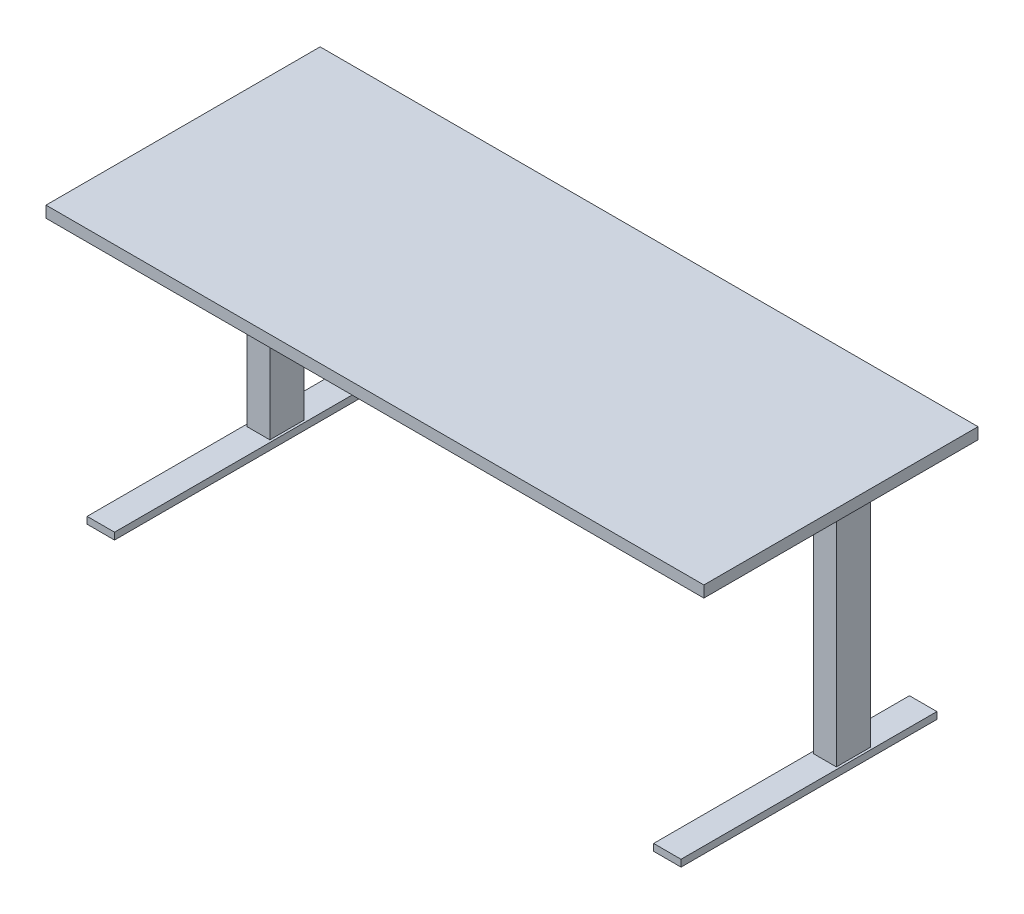
ISO-10303-21;
HEADER;
FILE_DESCRIPTION(('STEP AP214'),'2;1');
FILE_NAME('part.step','',(''),(''),'','','');
FILE_SCHEMA(('AUTOMOTIVE_DESIGN { 1 0 10303 214 1 1 1 1 }'));
ENDSEC;
DATA;
#1=APPLICATION_CONTEXT('core data for automotive mechanical design processes');
#2=APPLICATION_PROTOCOL_DEFINITION('international standard','automotive_design',2000,#1);
#3=PRODUCT_CONTEXT('',#1,'mechanical');
#4=PRODUCT('Part','Part','',(#3));
#5=PRODUCT_RELATED_PRODUCT_CATEGORY('part','',(#4));
#6=PRODUCT_DEFINITION_FORMATION('','',#4);
#7=PRODUCT_DEFINITION_CONTEXT('part definition',#1,'design');
#8=PRODUCT_DEFINITION('design','',#6,#7);
#9=PRODUCT_DEFINITION_SHAPE('','',#8);
#10=(LENGTH_UNIT() NAMED_UNIT(*) SI_UNIT(.MILLI.,.METRE.));
#11=(NAMED_UNIT(*) PLANE_ANGLE_UNIT() SI_UNIT($,.RADIAN.));
#12=(NAMED_UNIT(*) SI_UNIT($,.STERADIAN.) SOLID_ANGLE_UNIT());
#13=UNCERTAINTY_MEASURE_WITH_UNIT(LENGTH_MEASURE(1.E-05),#10,'distance_accuracy_value','');
#14=(GEOMETRIC_REPRESENTATION_CONTEXT(3) GLOBAL_UNCERTAINTY_ASSIGNED_CONTEXT((#13)) GLOBAL_UNIT_ASSIGNED_CONTEXT((#10,
#11,#12)) REPRESENTATION_CONTEXT('',''));
#15=CARTESIAN_POINT('',(0.,0.,0.));
#16=DIRECTION('',(0.,0.,1.));
#17=DIRECTION('',(1.,0.,0.));
#18=AXIS2_PLACEMENT_3D('',#15,#16,#17);
#19=CARTESIAN_POINT('',(819.15,-82.55,-279.4));
#20=DIRECTION('',(-1.,0.,0.));
#21=DIRECTION('',(0.,0.,1.));
#22=AXIS2_PLACEMENT_3D('',#19,#20,#21);
#23=PLANE('',#22);
#24=DIRECTION('',(0.,1.,0.));
#25=VECTOR('',#24,1.);
#26=CARTESIAN_POINT('',(819.15,-717.55,-82.55));
#27=LINE('',#26,#25);
#28=CARTESIAN_POINT('',(819.15,-82.55,-82.55));
#29=VERTEX_POINT('',#28);
#30=CARTESIAN_POINT('',(819.15,-31.75,-82.5500000000001));
#31=VERTEX_POINT('',#30);
#32=EDGE_CURVE('E298',#29,#31,#27,.T.);
#33=ORIENTED_EDGE('',*,*,#32,.F.);
#34=DIRECTION('',(0.,0.,1.));
#35=VECTOR('',#34,1.);
#36=CARTESIAN_POINT('',(819.15,-82.55,-279.4));
#37=LINE('',#36,#35);
#38=CARTESIAN_POINT('',(819.15,-82.55,-38.1));
#39=VERTEX_POINT('',#38);
#40=EDGE_CURVE('E310',#29,#39,#37,.T.);
#41=ORIENTED_EDGE('',*,*,#40,.T.);
#42=DIRECTION('',(0.,1.,0.));
#43=VECTOR('',#42,1.);
#44=CARTESIAN_POINT('',(819.15,-82.55,-38.1));
#45=LINE('',#44,#43);
#46=CARTESIAN_POINT('',(819.15,-31.75,-38.1));
#47=VERTEX_POINT('',#46);
#48=EDGE_CURVE('E331',#39,#47,#45,.T.);
#49=ORIENTED_EDGE('',*,*,#48,.T.);
#50=DIRECTION('',(0.,0.,1.));
#51=VECTOR('',#50,1.);
#52=CARTESIAN_POINT('',(819.15,-31.75,-279.4));
#53=LINE('',#52,#51);
#54=EDGE_CURVE('E322',#31,#47,#53,.T.);
#55=ORIENTED_EDGE('',*,*,#54,.F.);
#56=EDGE_LOOP('',(#33,#41,#49,#55));
#57=FACE_BOUND('',#56,.T.);
#58=ADVANCED_FACE('F39',(#57),#23,.T.);
#59=CARTESIAN_POINT('',(0.,-31.75,0.));
#60=DIRECTION('',(0.,-1.,0.));
#61=DIRECTION('',(0.,0.,-1.));
#62=AXIS2_PLACEMENT_3D('',#59,#60,#61);
#63=PLANE('',#62);
#64=DIRECTION('',(1.,0.,0.));
#65=VECTOR('',#64,1.);
#66=CARTESIAN_POINT('',(819.15,-31.75,-82.55));
#67=LINE('',#66,#65);
#68=CARTESIAN_POINT('',(755.65,-31.75,-82.55));
#69=VERTEX_POINT('',#68);
#70=EDGE_CURVE('E274',#69,#31,#67,.T.);
#71=ORIENTED_EDGE('',*,*,#70,.T.);
#72=ORIENTED_EDGE('',*,*,#54,.T.);
#73=DIRECTION('',(1.,0.,0.));
#74=VECTOR('',#73,1.);
#75=CARTESIAN_POINT('',(850.9,-31.75,-38.1));
#76=LINE('',#75,#74);
#77=CARTESIAN_POINT('',(850.9,-31.75,-38.1));
#78=VERTEX_POINT('',#77);
#79=EDGE_CURVE('E320',#47,#78,#76,.T.);
#80=ORIENTED_EDGE('',*,*,#79,.T.);
#81=DIRECTION('',(0.,0.,-1.));
#82=VECTOR('',#81,1.);
#83=CARTESIAN_POINT('',(850.9,-31.75,-279.4));
#84=LINE('',#83,#82);
#85=CARTESIAN_POINT('',(850.9,-31.75,-279.4));
#86=VERTEX_POINT('',#85);
#87=EDGE_CURVE('E302',#78,#86,#84,.T.);
#88=ORIENTED_EDGE('',*,*,#87,.T.);
#89=DIRECTION('',(-1.,0.,0.));
#90=VECTOR('',#89,1.);
#91=CARTESIAN_POINT('',(850.9,-31.75,-279.4));
#92=LINE('',#91,#90);
#93=CARTESIAN_POINT('',(819.15,-31.75,-279.4));
#94=VERTEX_POINT('',#93);
#95=EDGE_CURVE('E307',#86,#94,#92,.T.);
#96=ORIENTED_EDGE('',*,*,#95,.T.);
#97=CARTESIAN_POINT('',(819.15,-31.75,-177.8));
#98=VERTEX_POINT('',#97);
#99=EDGE_CURVE('E323',#94,#98,#53,.T.);
#100=ORIENTED_EDGE('',*,*,#99,.T.);
#101=DIRECTION('',(-1.,0.,0.));
#102=VECTOR('',#101,1.);
#103=CARTESIAN_POINT('',(819.15,-31.75,-177.8));
#104=LINE('',#103,#102);
#105=CARTESIAN_POINT('',(755.65,-31.75,-177.8));
#106=VERTEX_POINT('',#105);
#107=EDGE_CURVE('E61',#98,#106,#104,.T.);
#108=ORIENTED_EDGE('',*,*,#107,.T.);
#109=DIRECTION('',(0.,0.,1.));
#110=VECTOR('',#109,1.);
#111=CARTESIAN_POINT('',(755.65,-31.75,-177.8));
#112=LINE('',#111,#110);
#113=EDGE_CURVE('E56',#106,#69,#112,.T.);
#114=ORIENTED_EDGE('',*,*,#113,.T.);
#115=EDGE_LOOP('',(#71,#72,#80,#88,#96,#100,#108,#114));
#116=FACE_BOUND('',#115,.T.);
#117=DIRECTION('',(0.,0.,-1.));
#118=VECTOR('',#117,1.);
#119=CARTESIAN_POINT('',(914.4,-31.75,381.));
#120=LINE('',#119,#118);
#121=CARTESIAN_POINT('',(914.4,-31.75,381.));
#122=VERTEX_POINT('',#121);
#123=CARTESIAN_POINT('',(914.4,-31.75,-381.));
#124=VERTEX_POINT('',#123);
#125=EDGE_CURVE('E435',#122,#124,#120,.T.);
#126=ORIENTED_EDGE('',*,*,#125,.F.);
#127=DIRECTION('',(1.,0.,0.));
#128=VECTOR('',#127,1.);
#129=CARTESIAN_POINT('',(-914.4,-31.75,381.));
#130=LINE('',#129,#128);
#131=CARTESIAN_POINT('',(-914.4,-31.75,381.));
#132=VERTEX_POINT('',#131);
#133=EDGE_CURVE('E445',#132,#122,#130,.T.);
#134=ORIENTED_EDGE('',*,*,#133,.F.);
#135=DIRECTION('',(0.,0.,1.));
#136=VECTOR('',#135,1.);
#137=CARTESIAN_POINT('',(-914.4,-31.75,381.));
#138=LINE('',#137,#136);
#139=CARTESIAN_POINT('',(-914.4,-31.75,-381.));
#140=VERTEX_POINT('',#139);
#141=EDGE_CURVE('E442',#140,#132,#138,.T.);
#142=ORIENTED_EDGE('',*,*,#141,.F.);
#143=DIRECTION('',(-1.,0.,0.));
#144=VECTOR('',#143,1.);
#145=CARTESIAN_POINT('',(-914.4,-31.75,-381.));
#146=LINE('',#145,#144);
#147=EDGE_CURVE('E438',#124,#140,#146,.T.);
#148=ORIENTED_EDGE('',*,*,#147,.F.);
#149=EDGE_LOOP('',(#126,#134,#142,#148));
#150=FACE_BOUND('',#149,.T.);
#151=DIRECTION('',(0.,0.,1.));
#152=VECTOR('',#151,1.);
#153=CARTESIAN_POINT('',(-755.65,-31.75,-177.8));
#154=LINE('',#153,#152);
#155=CARTESIAN_POINT('',(-755.65,-31.75,-177.8));
#156=VERTEX_POINT('',#155);
#157=CARTESIAN_POINT('',(-755.65,-31.75,-82.55));
#158=VERTEX_POINT('',#157);
#159=EDGE_CURVE('E385',#156,#158,#154,.T.);
#160=ORIENTED_EDGE('',*,*,#159,.F.);
#161=DIRECTION('',(1.,0.,0.));
#162=VECTOR('',#161,1.);
#163=CARTESIAN_POINT('',(-819.15,-31.75,-177.8));
#164=LINE('',#163,#162);
#165=CARTESIAN_POINT('',(-819.15,-31.75,-177.8));
#166=VERTEX_POINT('',#165);
#167=EDGE_CURVE('E357',#166,#156,#164,.T.);
#168=ORIENTED_EDGE('',*,*,#167,.F.);
#169=DIRECTION('',(0.,0.,1.));
#170=VECTOR('',#169,1.);
#171=CARTESIAN_POINT('',(-819.15,-31.75,-279.4));
#172=LINE('',#171,#170);
#173=CARTESIAN_POINT('',(-819.15,-31.75,-279.4));
#174=VERTEX_POINT('',#173);
#175=EDGE_CURVE('E420',#174,#166,#172,.T.);
#176=ORIENTED_EDGE('',*,*,#175,.F.);
#177=DIRECTION('',(1.,0.,0.));
#178=VECTOR('',#177,1.);
#179=CARTESIAN_POINT('',(-850.9,-31.75,-279.4));
#180=LINE('',#179,#178);
#181=CARTESIAN_POINT('',(-850.9,-31.75,-279.4));
#182=VERTEX_POINT('',#181);
#183=EDGE_CURVE('E417',#182,#174,#180,.T.);
#184=ORIENTED_EDGE('',*,*,#183,.F.);
#185=DIRECTION('',(0.,0.,-1.));
#186=VECTOR('',#185,1.);
#187=CARTESIAN_POINT('',(-850.9,-31.75,-279.4));
#188=LINE('',#187,#186);
#189=CARTESIAN_POINT('',(-850.9,-31.75,-38.1));
#190=VERTEX_POINT('',#189);
#191=EDGE_CURVE('E400',#190,#182,#188,.T.);
#192=ORIENTED_EDGE('',*,*,#191,.F.);
#193=DIRECTION('',(-1.,0.,0.));
#194=VECTOR('',#193,1.);
#195=CARTESIAN_POINT('',(-850.9,-31.75,-38.1));
#196=LINE('',#195,#194);
#197=CARTESIAN_POINT('',(-819.15,-31.75,-38.1));
#198=VERTEX_POINT('',#197);
#199=EDGE_CURVE('E405',#198,#190,#196,.T.);
#200=ORIENTED_EDGE('',*,*,#199,.F.);
#201=CARTESIAN_POINT('',(-819.15,-31.75,-82.55));
#202=VERTEX_POINT('',#201);
#203=EDGE_CURVE('E419',#202,#198,#172,.T.);
#204=ORIENTED_EDGE('',*,*,#203,.F.);
#205=DIRECTION('',(-1.,0.,0.));
#206=VECTOR('',#205,1.);
#207=CARTESIAN_POINT('',(-819.15,-31.75,-82.55));
#208=LINE('',#207,#206);
#209=EDGE_CURVE('E374',#158,#202,#208,.T.);
#210=ORIENTED_EDGE('',*,*,#209,.F.);
#211=EDGE_LOOP('',(#160,#168,#176,#184,#192,#200,#204,#210));
#212=FACE_BOUND('',#211,.T.);
#213=ADVANCED_FACE('F474',(#116,#150,#212),#63,.T.);
#214=CARTESIAN_POINT('',(-819.15,-82.55,-279.4));
#215=DIRECTION('',(-1.,0.,0.));
#216=DIRECTION('',(0.,0.,1.));
#217=AXIS2_PLACEMENT_3D('',#214,#215,#216);
#218=PLANE('',#217);
#219=DIRECTION('',(0.,1.,0.));
#220=VECTOR('',#219,1.);
#221=CARTESIAN_POINT('',(-819.15,-717.55,-177.8));
#222=LINE('',#221,#220);
#223=CARTESIAN_POINT('',(-819.15,-82.55,-177.8));
#224=VERTEX_POINT('',#223);
#225=EDGE_CURVE('E396',#224,#166,#222,.T.);
#226=ORIENTED_EDGE('',*,*,#225,.F.);
#227=DIRECTION('',(0.,0.,1.));
#228=VECTOR('',#227,1.);
#229=CARTESIAN_POINT('',(-819.15,-82.55,-279.4));
#230=LINE('',#229,#228);
#231=CARTESIAN_POINT('',(-819.15,-82.55,-279.4));
#232=VERTEX_POINT('',#231);
#233=EDGE_CURVE('E408',#232,#224,#230,.T.);
#234=ORIENTED_EDGE('',*,*,#233,.F.);
#235=DIRECTION('',(0.,1.,0.));
#236=VECTOR('',#235,1.);
#237=CARTESIAN_POINT('',(-819.15,-82.55,-279.4));
#238=LINE('',#237,#236);
#239=EDGE_CURVE('E429',#232,#174,#238,.T.);
#240=ORIENTED_EDGE('',*,*,#239,.T.);
#241=ORIENTED_EDGE('',*,*,#175,.T.);
#242=EDGE_LOOP('',(#226,#234,#240,#241));
#243=FACE_BOUND('',#242,.T.);
#244=ADVANCED_FACE('F493',(#243),#218,.F.);
#245=DIRECTION('',(0.,1.,0.));
#246=VECTOR('',#245,1.);
#247=CARTESIAN_POINT('',(-819.15,-717.55,-82.55));
#248=LINE('',#247,#246);
#249=CARTESIAN_POINT('',(-819.15,-82.55,-82.5500000000001));
#250=VERTEX_POINT('',#249);
#251=EDGE_CURVE('E383',#250,#202,#248,.T.);
#252=ORIENTED_EDGE('',*,*,#251,.T.);
#253=ORIENTED_EDGE('',*,*,#203,.T.);
#254=DIRECTION('',(0.,1.,0.));
#255=VECTOR('',#254,1.);
#256=CARTESIAN_POINT('',(-819.15,-82.55,-38.1));
#257=LINE('',#256,#255);
#258=CARTESIAN_POINT('',(-819.15,-82.55,-38.1));
#259=VERTEX_POINT('',#258);
#260=EDGE_CURVE('E426',#259,#198,#257,.T.);
#261=ORIENTED_EDGE('',*,*,#260,.F.);
#262=EDGE_CURVE('E407',#250,#259,#230,.T.);
#263=ORIENTED_EDGE('',*,*,#262,.F.);
#264=EDGE_LOOP('',(#252,#253,#261,#263));
#265=FACE_BOUND('',#264,.T.);
#266=ADVANCED_FACE('F801',(#265),#218,.F.);
#267=CARTESIAN_POINT('',(914.4,-31.75,381.));
#268=DIRECTION('',(1.,0.,0.));
#269=DIRECTION('',(0.,0.,-1.));
#270=AXIS2_PLACEMENT_3D('',#267,#268,#269);
#271=PLANE('',#270);
#272=DIRECTION('',(0.,0.,-1.));
#273=VECTOR('',#272,1.);
#274=CARTESIAN_POINT('',(914.4,0.,381.));
#275=LINE('',#274,#273);
#276=CARTESIAN_POINT('',(914.4,0.,381.));
#277=VERTEX_POINT('',#276);
#278=CARTESIAN_POINT('',(914.4,0.,-381.));
#279=VERTEX_POINT('',#278);
#280=EDGE_CURVE('E434',#277,#279,#275,.T.);
#281=ORIENTED_EDGE('',*,*,#280,.F.);
#282=DIRECTION('',(0.,1.,0.));
#283=VECTOR('',#282,1.);
#284=CARTESIAN_POINT('',(914.4,-31.75,381.));
#285=LINE('',#284,#283);
#286=EDGE_CURVE('E12',#122,#277,#285,.T.);
#287=ORIENTED_EDGE('',*,*,#286,.F.);
#288=ORIENTED_EDGE('',*,*,#125,.T.);
#289=DIRECTION('',(0.,1.,0.));
#290=VECTOR('',#289,1.);
#291=CARTESIAN_POINT('',(914.4,-31.75,-381.));
#292=LINE('',#291,#290);
#293=EDGE_CURVE('E43',#124,#279,#292,.T.);
#294=ORIENTED_EDGE('',*,*,#293,.T.);
#295=EDGE_LOOP('',(#281,#287,#288,#294));
#296=FACE_BOUND('',#295,.T.);
#297=ADVANCED_FACE('F41',(#296),#271,.T.);
#298=CARTESIAN_POINT('',(-914.4,-31.75,381.));
#299=DIRECTION('',(0.,0.,1.));
#300=DIRECTION('',(1.,0.,0.));
#301=AXIS2_PLACEMENT_3D('',#298,#299,#300);
#302=PLANE('',#301);
#303=DIRECTION('',(1.,0.,0.));
#304=VECTOR('',#303,1.);
#305=CARTESIAN_POINT('',(-914.4,0.,381.));
#306=LINE('',#305,#304);
#307=CARTESIAN_POINT('',(-914.4,0.,381.));
#308=VERTEX_POINT('',#307);
#309=EDGE_CURVE('E439',#308,#277,#306,.T.);
#310=ORIENTED_EDGE('',*,*,#309,.F.);
#311=DIRECTION('',(0.,1.,0.));
#312=VECTOR('',#311,1.);
#313=CARTESIAN_POINT('',(-914.4,-31.75,381.));
#314=LINE('',#313,#312);
#315=EDGE_CURVE('E48',#132,#308,#314,.T.);
#316=ORIENTED_EDGE('',*,*,#315,.F.);
#317=ORIENTED_EDGE('',*,*,#133,.T.);
#318=ORIENTED_EDGE('',*,*,#286,.T.);
#319=EDGE_LOOP('',(#310,#316,#317,#318));
#320=FACE_BOUND('',#319,.T.);
#321=ADVANCED_FACE('F471',(#320),#302,.T.);
#322=CARTESIAN_POINT('',(-914.4,-31.75,381.));
#323=DIRECTION('',(-1.,0.,0.));
#324=DIRECTION('',(0.,0.,1.));
#325=AXIS2_PLACEMENT_3D('',#322,#323,#324);
#326=PLANE('',#325);
#327=DIRECTION('',(0.,0.,1.));
#328=VECTOR('',#327,1.);
#329=CARTESIAN_POINT('',(-914.4,0.,381.));
#330=LINE('',#329,#328);
#331=CARTESIAN_POINT('',(-914.4,0.,-381.));
#332=VERTEX_POINT('',#331);
#333=EDGE_CURVE('E453',#332,#308,#330,.T.);
#334=ORIENTED_EDGE('',*,*,#333,.F.);
#335=DIRECTION('',(0.,1.,0.));
#336=VECTOR('',#335,1.);
#337=CARTESIAN_POINT('',(-914.4,-31.75,-381.));
#338=LINE('',#337,#336);
#339=EDGE_CURVE('E458',#140,#332,#338,.T.);
#340=ORIENTED_EDGE('',*,*,#339,.F.);
#341=ORIENTED_EDGE('',*,*,#141,.T.);
#342=ORIENTED_EDGE('',*,*,#315,.T.);
#343=EDGE_LOOP('',(#334,#340,#341,#342));
#344=FACE_BOUND('',#343,.T.);
#345=ADVANCED_FACE('F478',(#344),#326,.T.);
#346=CARTESIAN_POINT('',(-914.4,-31.75,-381.));
#347=DIRECTION('',(0.,0.,-1.));
#348=DIRECTION('',(-1.,0.,0.));
#349=AXIS2_PLACEMENT_3D('',#346,#347,#348);
#350=PLANE('',#349);
#351=DIRECTION('',(-1.,0.,0.));
#352=VECTOR('',#351,1.);
#353=CARTESIAN_POINT('',(-914.4,0.,-381.));
#354=LINE('',#353,#352);
#355=EDGE_CURVE('E450',#279,#332,#354,.T.);
#356=ORIENTED_EDGE('',*,*,#355,.F.);
#357=ORIENTED_EDGE('',*,*,#293,.F.);
#358=ORIENTED_EDGE('',*,*,#147,.T.);
#359=ORIENTED_EDGE('',*,*,#339,.T.);
#360=EDGE_LOOP('',(#356,#357,#358,#359));
#361=FACE_BOUND('',#360,.T.);
#362=ADVANCED_FACE('F466',(#361),#350,.T.);
#363=CARTESIAN_POINT('',(0.,0.,0.));
#364=DIRECTION('',(0.,-1.,0.));
#365=DIRECTION('',(0.,0.,-1.));
#366=AXIS2_PLACEMENT_3D('',#363,#364,#365);
#367=PLANE('',#366);
#368=ORIENTED_EDGE('',*,*,#280,.T.);
#369=ORIENTED_EDGE('',*,*,#355,.T.);
#370=ORIENTED_EDGE('',*,*,#333,.T.);
#371=ORIENTED_EDGE('',*,*,#309,.T.);
#372=EDGE_LOOP('',(#368,#369,#370,#371));
#373=FACE_BOUND('',#372,.T.);
#374=ADVANCED_FACE('F468',(#373),#367,.F.);
#375=CARTESIAN_POINT('',(-850.9,-82.55,-279.4));
#376=DIRECTION('',(1.,0.,0.));
#377=DIRECTION('',(0.,0.,-1.));
#378=AXIS2_PLACEMENT_3D('',#375,#376,#377);
#379=PLANE('',#378);
#380=ORIENTED_EDGE('',*,*,#191,.T.);
#381=DIRECTION('',(0.,1.,0.));
#382=VECTOR('',#381,1.);
#383=CARTESIAN_POINT('',(-850.9,-82.55,-279.4));
#384=LINE('',#383,#382);
#385=CARTESIAN_POINT('',(-850.9,-82.55,-279.4));
#386=VERTEX_POINT('',#385);
#387=EDGE_CURVE('E432',#386,#182,#384,.T.);
#388=ORIENTED_EDGE('',*,*,#387,.F.);
#389=DIRECTION('',(0.,0.,-1.));
#390=VECTOR('',#389,1.);
#391=CARTESIAN_POINT('',(-850.9,-82.55,-279.4));
#392=LINE('',#391,#390);
#393=CARTESIAN_POINT('',(-850.9,-82.55,-38.1));
#394=VERTEX_POINT('',#393);
#395=EDGE_CURVE('E401',#394,#386,#392,.T.);
#396=ORIENTED_EDGE('',*,*,#395,.F.);
#397=DIRECTION('',(0.,1.,0.));
#398=VECTOR('',#397,1.);
#399=CARTESIAN_POINT('',(-850.9,-82.55,-38.1));
#400=LINE('',#399,#398);
#401=EDGE_CURVE('E414',#394,#190,#400,.T.);
#402=ORIENTED_EDGE('',*,*,#401,.T.);
#403=EDGE_LOOP('',(#380,#388,#396,#402));
#404=FACE_BOUND('',#403,.T.);
#405=ADVANCED_FACE('F840',(#404),#379,.F.);
#406=CARTESIAN_POINT('',(-850.9,-82.55,-279.4));
#407=DIRECTION('',(0.,0.,1.));
#408=DIRECTION('',(1.,0.,0.));
#409=AXIS2_PLACEMENT_3D('',#406,#407,#408);
#410=PLANE('',#409);
#411=ORIENTED_EDGE('',*,*,#183,.T.);
#412=ORIENTED_EDGE('',*,*,#239,.F.);
#413=DIRECTION('',(1.,0.,0.));
#414=VECTOR('',#413,1.);
#415=CARTESIAN_POINT('',(-850.9,-82.55,-279.4));
#416=LINE('',#415,#414);
#417=EDGE_CURVE('E404',#386,#232,#416,.T.);
#418=ORIENTED_EDGE('',*,*,#417,.F.);
#419=ORIENTED_EDGE('',*,*,#387,.T.);
#420=EDGE_LOOP('',(#411,#412,#418,#419));
#421=FACE_BOUND('',#420,.T.);
#422=ADVANCED_FACE('F831',(#421),#410,.F.);
#423=CARTESIAN_POINT('',(-850.9,-82.55,-38.1));
#424=DIRECTION('',(0.,0.,-1.));
#425=DIRECTION('',(-1.,0.,0.));
#426=AXIS2_PLACEMENT_3D('',#423,#424,#425);
#427=PLANE('',#426);
#428=ORIENTED_EDGE('',*,*,#199,.T.);
#429=ORIENTED_EDGE('',*,*,#401,.F.);
#430=DIRECTION('',(-1.,0.,0.));
#431=VECTOR('',#430,1.);
#432=CARTESIAN_POINT('',(-850.9,-82.55,-38.1));
#433=LINE('',#432,#431);
#434=EDGE_CURVE('E411',#259,#394,#433,.T.);
#435=ORIENTED_EDGE('',*,*,#434,.F.);
#436=ORIENTED_EDGE('',*,*,#260,.T.);
#437=EDGE_LOOP('',(#428,#429,#435,#436));
#438=FACE_BOUND('',#437,.T.);
#439=ADVANCED_FACE('F822',(#438),#427,.F.);
#440=CARTESIAN_POINT('',(0.,-82.55,0.));
#441=DIRECTION('',(0.,1.,0.));
#442=DIRECTION('',(0.,0.,1.));
#443=AXIS2_PLACEMENT_3D('',#440,#441,#442);
#444=PLANE('',#443);
#445=ORIENTED_EDGE('',*,*,#395,.T.);
#446=ORIENTED_EDGE('',*,*,#417,.T.);
#447=ORIENTED_EDGE('',*,*,#233,.T.);
#448=EDGE_CURVE('E412',#224,#250,#230,.T.);
#449=ORIENTED_EDGE('',*,*,#448,.T.);
#450=ORIENTED_EDGE('',*,*,#262,.T.);
#451=ORIENTED_EDGE('',*,*,#434,.T.);
#452=EDGE_LOOP('',(#445,#446,#447,#449,#450,#451));
#453=FACE_BOUND('',#452,.T.);
#454=ADVANCED_FACE('F785',(#453),#444,.F.);
#455=CARTESIAN_POINT('',(-819.15,-717.55,-177.8));
#456=DIRECTION('',(1.,0.,0.));
#457=DIRECTION('',(0.,0.,-1.));
#458=AXIS2_PLACEMENT_3D('',#455,#456,#457);
#459=PLANE('',#458);
#460=CARTESIAN_POINT('',(-819.15,-717.55,-82.55));
#461=VERTEX_POINT('',#460);
#462=EDGE_CURVE('E388',#461,#250,#248,.T.);
#463=ORIENTED_EDGE('',*,*,#462,.T.);
#464=ORIENTED_EDGE('',*,*,#448,.F.);
#465=CARTESIAN_POINT('',(-819.15,-717.55,-177.8));
#466=VERTEX_POINT('',#465);
#467=EDGE_CURVE('E397',#466,#224,#222,.T.);
#468=ORIENTED_EDGE('',*,*,#467,.F.);
#469=DIRECTION('',(0.,0.,-1.));
#470=VECTOR('',#469,1.);
#471=CARTESIAN_POINT('',(-819.15,-717.55,-177.8));
#472=LINE('',#471,#470);
#473=EDGE_CURVE('E370',#461,#466,#472,.T.);
#474=ORIENTED_EDGE('',*,*,#473,.F.);
#475=EDGE_LOOP('',(#463,#464,#468,#474));
#476=FACE_BOUND('',#475,.T.);
#477=ADVANCED_FACE('F775',(#476),#459,.F.);
#478=CARTESIAN_POINT('',(-819.15,-717.55,-177.8));
#479=DIRECTION('',(0.,0.,1.));
#480=DIRECTION('',(1.,0.,0.));
#481=AXIS2_PLACEMENT_3D('',#478,#479,#480);
#482=PLANE('',#481);
#483=ORIENTED_EDGE('',*,*,#167,.T.);
#484=DIRECTION('',(0.,1.,0.));
#485=VECTOR('',#484,1.);
#486=CARTESIAN_POINT('',(-755.65,-717.55,-177.8));
#487=LINE('',#486,#485);
#488=CARTESIAN_POINT('',(-755.65,-717.55,-177.8));
#489=VERTEX_POINT('',#488);
#490=EDGE_CURVE('E393',#489,#156,#487,.T.);
#491=ORIENTED_EDGE('',*,*,#490,.F.);
#492=DIRECTION('',(1.,0.,0.));
#493=VECTOR('',#492,1.);
#494=CARTESIAN_POINT('',(-819.15,-717.55,-177.8));
#495=LINE('',#494,#493);
#496=EDGE_CURVE('E373',#466,#489,#495,.T.);
#497=ORIENTED_EDGE('',*,*,#496,.F.);
#498=ORIENTED_EDGE('',*,*,#467,.T.);
#499=ORIENTED_EDGE('',*,*,#225,.T.);
#500=EDGE_LOOP('',(#483,#491,#497,#498,#499));
#501=FACE_BOUND('',#500,.T.);
#502=ADVANCED_FACE('F765',(#501),#482,.F.);
#503=CARTESIAN_POINT('',(-755.65,-717.55,-177.8));
#504=DIRECTION('',(-1.,0.,0.));
#505=DIRECTION('',(0.,0.,1.));
#506=AXIS2_PLACEMENT_3D('',#503,#504,#505);
#507=PLANE('',#506);
#508=ORIENTED_EDGE('',*,*,#159,.T.);
#509=DIRECTION('',(0.,1.,0.));
#510=VECTOR('',#509,1.);
#511=CARTESIAN_POINT('',(-755.65,-717.55,-82.55));
#512=LINE('',#511,#510);
#513=CARTESIAN_POINT('',(-755.65,-717.55,-82.55));
#514=VERTEX_POINT('',#513);
#515=EDGE_CURVE('E390',#514,#158,#512,.T.);
#516=ORIENTED_EDGE('',*,*,#515,.F.);
#517=DIRECTION('',(0.,0.,1.));
#518=VECTOR('',#517,1.);
#519=CARTESIAN_POINT('',(-755.65,-717.55,-177.8));
#520=LINE('',#519,#518);
#521=EDGE_CURVE('E377',#489,#514,#520,.T.);
#522=ORIENTED_EDGE('',*,*,#521,.F.);
#523=ORIENTED_EDGE('',*,*,#490,.T.);
#524=EDGE_LOOP('',(#508,#516,#522,#523));
#525=FACE_BOUND('',#524,.T.);
#526=ADVANCED_FACE('F755',(#525),#507,.F.);
#527=CARTESIAN_POINT('',(-819.15,-717.55,-82.55));
#528=DIRECTION('',(0.,0.,-1.));
#529=DIRECTION('',(-1.,0.,0.));
#530=AXIS2_PLACEMENT_3D('',#527,#528,#529);
#531=PLANE('',#530);
#532=ORIENTED_EDGE('',*,*,#209,.T.);
#533=ORIENTED_EDGE('',*,*,#251,.F.);
#534=ORIENTED_EDGE('',*,*,#462,.F.);
#535=DIRECTION('',(-1.,0.,0.));
#536=VECTOR('',#535,1.);
#537=CARTESIAN_POINT('',(-819.15,-717.55,-82.55));
#538=LINE('',#537,#536);
#539=EDGE_CURVE('E380',#514,#461,#538,.T.);
#540=ORIENTED_EDGE('',*,*,#539,.F.);
#541=ORIENTED_EDGE('',*,*,#515,.T.);
#542=EDGE_LOOP('',(#532,#533,#534,#540,#541));
#543=FACE_BOUND('',#542,.T.);
#544=ADVANCED_FACE('F745',(#543),#531,.F.);
#545=CARTESIAN_POINT('',(-749.3,-2188.4704942887,-355.6));
#546=DIRECTION('',(-1.,0.,0.));
#547=DIRECTION('',(0.,0.,1.));
#548=AXIS2_PLACEMENT_3D('',#545,#546,#547);
#549=PLANE('',#548);
#550=DIRECTION('',(0.,0.,1.));
#551=VECTOR('',#550,1.);
#552=CARTESIAN_POINT('',(-749.3,-736.6,-355.6));
#553=LINE('',#552,#551);
#554=CARTESIAN_POINT('',(-749.3,-736.6,-355.6));
#555=VERTEX_POINT('',#554);
#556=CARTESIAN_POINT('',(-749.3,-736.600000000001,355.6));
#557=VERTEX_POINT('',#556);
#558=EDGE_CURVE('E361',#555,#557,#553,.T.);
#559=ORIENTED_EDGE('',*,*,#558,.F.);
#560=DIRECTION('',(0.,1.,0.));
#561=VECTOR('',#560,1.);
#562=CARTESIAN_POINT('',(-749.3,-2188.4704942887,-355.6));
#563=LINE('',#562,#561);
#564=CARTESIAN_POINT('',(-749.3,-717.55,-355.6));
#565=VERTEX_POINT('',#564);
#566=EDGE_CURVE('E337',#555,#565,#563,.T.);
#567=ORIENTED_EDGE('',*,*,#566,.T.);
#568=DIRECTION('',(0.,0.,1.));
#569=VECTOR('',#568,1.);
#570=CARTESIAN_POINT('',(-749.3,-717.55,-355.6));
#571=LINE('',#570,#569);
#572=CARTESIAN_POINT('',(-749.3,-717.55,355.6));
#573=VERTEX_POINT('',#572);
#574=EDGE_CURVE('E351',#565,#573,#571,.T.);
#575=ORIENTED_EDGE('',*,*,#574,.T.);
#576=DIRECTION('',(0.,1.,0.));
#577=VECTOR('',#576,1.);
#578=CARTESIAN_POINT('',(-749.3,-2188.4704942887,355.6));
#579=LINE('',#578,#577);
#580=EDGE_CURVE('E350',#557,#573,#579,.T.);
#581=ORIENTED_EDGE('',*,*,#580,.F.);
#582=EDGE_LOOP('',(#559,#567,#575,#581));
#583=FACE_BOUND('',#582,.T.);
#584=ADVANCED_FACE('F735',(#583),#549,.F.);
#585=CARTESIAN_POINT('',(-825.5,-2188.4704942887,355.6));
#586=DIRECTION('',(0.,0.,-1.));
#587=DIRECTION('',(-1.,0.,0.));
#588=AXIS2_PLACEMENT_3D('',#585,#586,#587);
#589=PLANE('',#588);
#590=DIRECTION('',(-1.,0.,0.));
#591=VECTOR('',#590,1.);
#592=CARTESIAN_POINT('',(-825.5,-736.6,355.6));
#593=LINE('',#592,#591);
#594=CARTESIAN_POINT('',(-825.5,-736.600000000001,355.6));
#595=VERTEX_POINT('',#594);
#596=EDGE_CURVE('E358',#557,#595,#593,.T.);
#597=ORIENTED_EDGE('',*,*,#596,.F.);
#598=ORIENTED_EDGE('',*,*,#580,.T.);
#599=DIRECTION('',(-1.,0.,0.));
#600=VECTOR('',#599,1.);
#601=CARTESIAN_POINT('',(-825.5,-717.55,355.6));
#602=LINE('',#601,#600);
#603=CARTESIAN_POINT('',(-825.5,-717.55,355.6));
#604=VERTEX_POINT('',#603);
#605=EDGE_CURVE('E347',#573,#604,#602,.T.);
#606=ORIENTED_EDGE('',*,*,#605,.T.);
#607=DIRECTION('',(0.,1.,0.));
#608=VECTOR('',#607,1.);
#609=CARTESIAN_POINT('',(-825.5,-2188.4704942887,355.6));
#610=LINE('',#609,#608);
#611=EDGE_CURVE('E346',#595,#604,#610,.T.);
#612=ORIENTED_EDGE('',*,*,#611,.F.);
#613=EDGE_LOOP('',(#597,#598,#606,#612));
#614=FACE_BOUND('',#613,.T.);
#615=ADVANCED_FACE('F725',(#614),#589,.F.);
#616=CARTESIAN_POINT('',(-825.5,-2188.4704942887,-355.6));
#617=DIRECTION('',(1.,0.,0.));
#618=DIRECTION('',(0.,0.,-1.));
#619=AXIS2_PLACEMENT_3D('',#616,#617,#618);
#620=PLANE('',#619);
#621=DIRECTION('',(0.,0.,-1.));
#622=VECTOR('',#621,1.);
#623=CARTESIAN_POINT('',(-825.5,-736.6,-355.6));
#624=LINE('',#623,#622);
#625=CARTESIAN_POINT('',(-825.5,-736.600000000001,-355.6));
#626=VERTEX_POINT('',#625);
#627=EDGE_CURVE('E354',#595,#626,#624,.T.);
#628=ORIENTED_EDGE('',*,*,#627,.F.);
#629=ORIENTED_EDGE('',*,*,#611,.T.);
#630=DIRECTION('',(0.,0.,-1.));
#631=VECTOR('',#630,1.);
#632=CARTESIAN_POINT('',(-825.5,-717.55,-355.6));
#633=LINE('',#632,#631);
#634=CARTESIAN_POINT('',(-825.5,-717.55,-355.6));
#635=VERTEX_POINT('',#634);
#636=EDGE_CURVE('E343',#604,#635,#633,.T.);
#637=ORIENTED_EDGE('',*,*,#636,.T.);
#638=DIRECTION('',(0.,1.,0.));
#639=VECTOR('',#638,1.);
#640=CARTESIAN_POINT('',(-825.5,-2188.4704942887,-355.6));
#641=LINE('',#640,#639);
#642=EDGE_CURVE('E342',#626,#635,#641,.T.);
#643=ORIENTED_EDGE('',*,*,#642,.F.);
#644=EDGE_LOOP('',(#628,#629,#637,#643));
#645=FACE_BOUND('',#644,.T.);
#646=ADVANCED_FACE('F715',(#645),#620,.F.);
#647=CARTESIAN_POINT('',(-825.5,-2188.4704942887,-355.6));
#648=DIRECTION('',(0.,0.,1.));
#649=DIRECTION('',(1.,0.,0.));
#650=AXIS2_PLACEMENT_3D('',#647,#648,#649);
#651=PLANE('',#650);
#652=DIRECTION('',(1.,0.,0.));
#653=VECTOR('',#652,1.);
#654=CARTESIAN_POINT('',(-825.5,-736.6,-355.6));
#655=LINE('',#654,#653);
#656=EDGE_CURVE('E341',#626,#555,#655,.T.);
#657=ORIENTED_EDGE('',*,*,#656,.F.);
#658=ORIENTED_EDGE('',*,*,#642,.T.);
#659=DIRECTION('',(1.,0.,0.));
#660=VECTOR('',#659,1.);
#661=CARTESIAN_POINT('',(-825.5,-717.55,-355.6));
#662=LINE('',#661,#660);
#663=EDGE_CURVE('E338',#635,#565,#662,.T.);
#664=ORIENTED_EDGE('',*,*,#663,.T.);
#665=ORIENTED_EDGE('',*,*,#566,.F.);
#666=EDGE_LOOP('',(#657,#658,#664,#665));
#667=FACE_BOUND('',#666,.T.);
#668=ADVANCED_FACE('F705',(#667),#651,.F.);
#669=CARTESIAN_POINT('',(0.,-717.55,0.));
#670=DIRECTION('',(0.,1.,0.));
#671=DIRECTION('',(0.,0.,1.));
#672=AXIS2_PLACEMENT_3D('',#669,#670,#671);
#673=PLANE('',#672);
#674=ORIENTED_EDGE('',*,*,#539,.T.);
#675=ORIENTED_EDGE('',*,*,#473,.T.);
#676=ORIENTED_EDGE('',*,*,#496,.T.);
#677=ORIENTED_EDGE('',*,*,#521,.T.);
#678=EDGE_LOOP('',(#674,#675,#676,#677));
#679=FACE_BOUND('',#678,.T.);
#680=ORIENTED_EDGE('',*,*,#574,.F.);
#681=ORIENTED_EDGE('',*,*,#663,.F.);
#682=ORIENTED_EDGE('',*,*,#636,.F.);
#683=ORIENTED_EDGE('',*,*,#605,.F.);
#684=EDGE_LOOP('',(#680,#681,#682,#683));
#685=FACE_BOUND('',#684,.T.);
#686=ADVANCED_FACE('F696',(#679,#685),#673,.T.);
#687=CARTESIAN_POINT('',(0.,-736.6,0.));
#688=DIRECTION('',(0.,-1.,0.));
#689=DIRECTION('',(0.,0.,-1.));
#690=AXIS2_PLACEMENT_3D('',#687,#688,#689);
#691=PLANE('',#690);
#692=ORIENTED_EDGE('',*,*,#656,.T.);
#693=ORIENTED_EDGE('',*,*,#558,.T.);
#694=ORIENTED_EDGE('',*,*,#596,.T.);
#695=ORIENTED_EDGE('',*,*,#627,.T.);
#696=EDGE_LOOP('',(#692,#693,#694,#695));
#697=FACE_BOUND('',#696,.T.);
#698=ADVANCED_FACE('F687',(#697),#691,.T.);
#699=CARTESIAN_POINT('',(850.9,-82.55,-279.4));
#700=DIRECTION('',(1.,0.,0.));
#701=DIRECTION('',(0.,0.,-1.));
#702=AXIS2_PLACEMENT_3D('',#699,#700,#701);
#703=PLANE('',#702);
#704=ORIENTED_EDGE('',*,*,#87,.F.);
#705=DIRECTION('',(0.,1.,0.));
#706=VECTOR('',#705,1.);
#707=CARTESIAN_POINT('',(850.9,-82.55,-38.1));
#708=LINE('',#707,#706);
#709=CARTESIAN_POINT('',(850.9,-82.55,-38.1));
#710=VERTEX_POINT('',#709);
#711=EDGE_CURVE('E334',#710,#78,#708,.T.);
#712=ORIENTED_EDGE('',*,*,#711,.F.);
#713=DIRECTION('',(0.,0.,-1.));
#714=VECTOR('',#713,1.);
#715=CARTESIAN_POINT('',(850.9,-82.55,-279.4));
#716=LINE('',#715,#714);
#717=CARTESIAN_POINT('',(850.9,-82.55,-279.4));
#718=VERTEX_POINT('',#717);
#719=EDGE_CURVE('E303',#710,#718,#716,.T.);
#720=ORIENTED_EDGE('',*,*,#719,.T.);
#721=DIRECTION('',(0.,1.,0.));
#722=VECTOR('',#721,1.);
#723=CARTESIAN_POINT('',(850.9,-82.55,-279.4));
#724=LINE('',#723,#722);
#725=EDGE_CURVE('E318',#718,#86,#724,.T.);
#726=ORIENTED_EDGE('',*,*,#725,.T.);
#727=EDGE_LOOP('',(#704,#712,#720,#726));
#728=FACE_BOUND('',#727,.T.);
#729=ADVANCED_FACE('F508',(#728),#703,.T.);
#730=CARTESIAN_POINT('',(850.9,-82.55,-38.1));
#731=DIRECTION('',(0.,0.,1.));
#732=DIRECTION('',(1.,0.,0.));
#733=AXIS2_PLACEMENT_3D('',#730,#731,#732);
#734=PLANE('',#733);
#735=ORIENTED_EDGE('',*,*,#79,.F.);
#736=ORIENTED_EDGE('',*,*,#48,.F.);
#737=DIRECTION('',(1.,0.,0.));
#738=VECTOR('',#737,1.);
#739=CARTESIAN_POINT('',(850.9,-82.55,-38.1));
#740=LINE('',#739,#738);
#741=EDGE_CURVE('E306',#39,#710,#740,.T.);
#742=ORIENTED_EDGE('',*,*,#741,.T.);
#743=ORIENTED_EDGE('',*,*,#711,.T.);
#744=EDGE_LOOP('',(#735,#736,#742,#743));
#745=FACE_BOUND('',#744,.T.);
#746=ADVANCED_FACE('F500',(#745),#734,.T.);
#747=DIRECTION('',(0.,1.,0.));
#748=VECTOR('',#747,1.);
#749=CARTESIAN_POINT('',(819.15,-717.55,-177.8));
#750=LINE('',#749,#748);
#751=CARTESIAN_POINT('',(819.15,-82.55,-177.8));
#752=VERTEX_POINT('',#751);
#753=EDGE_CURVE('E287',#752,#98,#750,.T.);
#754=ORIENTED_EDGE('',*,*,#753,.T.);
#755=ORIENTED_EDGE('',*,*,#99,.F.);
#756=DIRECTION('',(0.,1.,0.));
#757=VECTOR('',#756,1.);
#758=CARTESIAN_POINT('',(819.15,-82.55,-279.4));
#759=LINE('',#758,#757);
#760=CARTESIAN_POINT('',(819.15,-82.55,-279.4));
#761=VERTEX_POINT('',#760);
#762=EDGE_CURVE('E328',#761,#94,#759,.T.);
#763=ORIENTED_EDGE('',*,*,#762,.F.);
#764=EDGE_CURVE('E311',#761,#752,#37,.T.);
#765=ORIENTED_EDGE('',*,*,#764,.T.);
#766=EDGE_LOOP('',(#754,#755,#763,#765));
#767=FACE_BOUND('',#766,.T.);
#768=ADVANCED_FACE('F489',(#767),#23,.T.);
#769=CARTESIAN_POINT('',(850.9,-82.55,-279.4));
#770=DIRECTION('',(0.,0.,-1.));
#771=DIRECTION('',(-1.,0.,0.));
#772=AXIS2_PLACEMENT_3D('',#769,#770,#771);
#773=PLANE('',#772);
#774=ORIENTED_EDGE('',*,*,#95,.F.);
#775=ORIENTED_EDGE('',*,*,#725,.F.);
#776=DIRECTION('',(-1.,0.,0.));
#777=VECTOR('',#776,1.);
#778=CARTESIAN_POINT('',(850.9,-82.55,-279.4));
#779=LINE('',#778,#777);
#780=EDGE_CURVE('E314',#718,#761,#779,.T.);
#781=ORIENTED_EDGE('',*,*,#780,.T.);
#782=ORIENTED_EDGE('',*,*,#762,.T.);
#783=EDGE_LOOP('',(#774,#775,#781,#782));
#784=FACE_BOUND('',#783,.T.);
#785=ADVANCED_FACE('F499',(#784),#773,.T.);
#786=CARTESIAN_POINT('',(0.,-82.55,0.));
#787=DIRECTION('',(0.,1.,0.));
#788=DIRECTION('',(0.,0.,1.));
#789=AXIS2_PLACEMENT_3D('',#786,#787,#788);
#790=PLANE('',#789);
#791=ORIENTED_EDGE('',*,*,#719,.F.);
#792=ORIENTED_EDGE('',*,*,#741,.F.);
#793=ORIENTED_EDGE('',*,*,#40,.F.);
#794=EDGE_CURVE('E315',#752,#29,#37,.T.);
#795=ORIENTED_EDGE('',*,*,#794,.F.);
#796=ORIENTED_EDGE('',*,*,#764,.F.);
#797=ORIENTED_EDGE('',*,*,#780,.F.);
#798=EDGE_LOOP('',(#791,#792,#793,#795,#796,#797));
#799=FACE_BOUND('',#798,.T.);
#800=ADVANCED_FACE('F506',(#799),#790,.F.);
#801=CARTESIAN_POINT('',(819.15,-717.55,-177.8));
#802=DIRECTION('',(1.,0.,0.));
#803=DIRECTION('',(0.,0.,-1.));
#804=AXIS2_PLACEMENT_3D('',#801,#802,#803);
#805=PLANE('',#804);
#806=ORIENTED_EDGE('',*,*,#794,.T.);
#807=CARTESIAN_POINT('',(819.15,-717.55,-82.55));
#808=VERTEX_POINT('',#807);
#809=EDGE_CURVE('E299',#808,#29,#27,.T.);
#810=ORIENTED_EDGE('',*,*,#809,.F.);
#811=DIRECTION('',(0.,0.,-1.));
#812=VECTOR('',#811,1.);
#813=CARTESIAN_POINT('',(819.15,-717.55,-177.8));
#814=LINE('',#813,#812);
#815=CARTESIAN_POINT('',(819.15,-717.55,-177.8));
#816=VERTEX_POINT('',#815);
#817=EDGE_CURVE('E275',#808,#816,#814,.T.);
#818=ORIENTED_EDGE('',*,*,#817,.T.);
#819=EDGE_CURVE('E291',#816,#752,#750,.T.);
#820=ORIENTED_EDGE('',*,*,#819,.T.);
#821=EDGE_LOOP('',(#806,#810,#818,#820));
#822=FACE_BOUND('',#821,.T.);
#823=ADVANCED_FACE('F537',(#822),#805,.T.);
#824=CARTESIAN_POINT('',(819.15,-717.55,-82.55));
#825=DIRECTION('',(0.,0.,1.));
#826=DIRECTION('',(1.,0.,0.));
#827=AXIS2_PLACEMENT_3D('',#824,#825,#826);
#828=PLANE('',#827);
#829=ORIENTED_EDGE('',*,*,#70,.F.);
#830=DIRECTION('',(0.,1.,0.));
#831=VECTOR('',#830,1.);
#832=CARTESIAN_POINT('',(755.65,-717.55,-82.55));
#833=LINE('',#832,#831);
#834=CARTESIAN_POINT('',(755.65,-717.55,-82.55));
#835=VERTEX_POINT('',#834);
#836=EDGE_CURVE('E296',#835,#69,#833,.T.);
#837=ORIENTED_EDGE('',*,*,#836,.F.);
#838=DIRECTION('',(1.,0.,0.));
#839=VECTOR('',#838,1.);
#840=CARTESIAN_POINT('',(819.15,-717.55,-82.55));
#841=LINE('',#840,#839);
#842=EDGE_CURVE('E278',#835,#808,#841,.T.);
#843=ORIENTED_EDGE('',*,*,#842,.T.);
#844=ORIENTED_EDGE('',*,*,#809,.T.);
#845=ORIENTED_EDGE('',*,*,#32,.T.);
#846=EDGE_LOOP('',(#829,#837,#843,#844,#845));
#847=FACE_BOUND('',#846,.T.);
#848=ADVANCED_FACE('F524',(#847),#828,.T.);
#849=CARTESIAN_POINT('',(755.65,-717.55,-177.8));
#850=DIRECTION('',(-1.,0.,0.));
#851=DIRECTION('',(0.,0.,1.));
#852=AXIS2_PLACEMENT_3D('',#849,#850,#851);
#853=PLANE('',#852);
#854=ORIENTED_EDGE('',*,*,#113,.F.);
#855=DIRECTION('',(0.,1.,0.));
#856=VECTOR('',#855,1.);
#857=CARTESIAN_POINT('',(755.65,-717.55,-177.8));
#858=LINE('',#857,#856);
#859=CARTESIAN_POINT('',(755.65,-717.55,-177.8));
#860=VERTEX_POINT('',#859);
#861=EDGE_CURVE('E294',#860,#106,#858,.T.);
#862=ORIENTED_EDGE('',*,*,#861,.F.);
#863=DIRECTION('',(0.,0.,1.));
#864=VECTOR('',#863,1.);
#865=CARTESIAN_POINT('',(755.65,-717.55,-177.8));
#866=LINE('',#865,#864);
#867=EDGE_CURVE('E281',#860,#835,#866,.T.);
#868=ORIENTED_EDGE('',*,*,#867,.T.);
#869=ORIENTED_EDGE('',*,*,#836,.T.);
#870=EDGE_LOOP('',(#854,#862,#868,#869));
#871=FACE_BOUND('',#870,.T.);
#872=ADVANCED_FACE('F519',(#871),#853,.T.);
#873=CARTESIAN_POINT('',(819.15,-717.55,-177.8));
#874=DIRECTION('',(0.,0.,-1.));
#875=DIRECTION('',(-1.,0.,0.));
#876=AXIS2_PLACEMENT_3D('',#873,#874,#875);
#877=PLANE('',#876);
#878=ORIENTED_EDGE('',*,*,#107,.F.);
#879=ORIENTED_EDGE('',*,*,#753,.F.);
#880=ORIENTED_EDGE('',*,*,#819,.F.);
#881=DIRECTION('',(-1.,0.,0.));
#882=VECTOR('',#881,1.);
#883=CARTESIAN_POINT('',(819.15,-717.55,-177.8));
#884=LINE('',#883,#882);
#885=EDGE_CURVE('E284',#816,#860,#884,.T.);
#886=ORIENTED_EDGE('',*,*,#885,.T.);
#887=ORIENTED_EDGE('',*,*,#861,.T.);
#888=EDGE_LOOP('',(#878,#879,#880,#886,#887));
#889=FACE_BOUND('',#888,.T.);
#890=ADVANCED_FACE('F516',(#889),#877,.T.);
#891=CARTESIAN_POINT('',(0.,-717.55,0.));
#892=DIRECTION('',(0.,1.,0.));
#893=DIRECTION('',(0.,0.,1.));
#894=AXIS2_PLACEMENT_3D('',#891,#892,#893);
#895=PLANE('',#894);
#896=DIRECTION('',(0.,0.,1.));
#897=VECTOR('',#896,1.);
#898=CARTESIAN_POINT('',(749.3,-717.55,-355.6));
#899=LINE('',#898,#897);
#900=CARTESIAN_POINT('',(749.3,-717.55,-355.6));
#901=VERTEX_POINT('',#900);
#902=CARTESIAN_POINT('',(749.3,-717.55,355.6));
#903=VERTEX_POINT('',#902);
#904=EDGE_CURVE('E266',#901,#903,#899,.T.);
#905=ORIENTED_EDGE('',*,*,#904,.T.);
#906=DIRECTION('',(1.,0.,0.));
#907=VECTOR('',#906,1.);
#908=CARTESIAN_POINT('',(825.5,-717.55,355.6));
#909=LINE('',#908,#907);
#910=CARTESIAN_POINT('',(825.5,-717.55,355.6));
#911=VERTEX_POINT('',#910);
#912=EDGE_CURVE('E969',#903,#911,#909,.T.);
#913=ORIENTED_EDGE('',*,*,#912,.T.);
#914=DIRECTION('',(0.,0.,-1.));
#915=VECTOR('',#914,1.);
#916=CARTESIAN_POINT('',(825.5,-717.55,-355.6));
#917=LINE('',#916,#915);
#918=CARTESIAN_POINT('',(825.5,-717.55,-355.6));
#919=VERTEX_POINT('',#918);
#920=EDGE_CURVE('E252',#911,#919,#917,.T.);
#921=ORIENTED_EDGE('',*,*,#920,.T.);
#922=DIRECTION('',(-1.,0.,0.));
#923=VECTOR('',#922,1.);
#924=CARTESIAN_POINT('',(825.5,-717.55,-355.6));
#925=LINE('',#924,#923);
#926=EDGE_CURVE('E260',#919,#901,#925,.T.);
#927=ORIENTED_EDGE('',*,*,#926,.T.);
#928=EDGE_LOOP('',(#905,#913,#921,#927));
#929=FACE_BOUND('',#928,.T.);
#930=ORIENTED_EDGE('',*,*,#817,.F.);
#931=ORIENTED_EDGE('',*,*,#842,.F.);
#932=ORIENTED_EDGE('',*,*,#867,.F.);
#933=ORIENTED_EDGE('',*,*,#885,.F.);
#934=EDGE_LOOP('',(#930,#931,#932,#933));
#935=FACE_BOUND('',#934,.T.);
#936=ADVANCED_FACE('F539',(#929,#935),#895,.T.);
#937=CARTESIAN_POINT('',(0.,-736.6,0.));
#938=DIRECTION('',(0.,-1.,0.));
#939=DIRECTION('',(0.,0.,-1.));
#940=AXIS2_PLACEMENT_3D('',#937,#938,#939);
#941=PLANE('',#940);
#942=DIRECTION('',(0.,0.,1.));
#943=VECTOR('',#942,1.);
#944=CARTESIAN_POINT('',(749.3,-736.6,-355.6));
#945=LINE('',#944,#943);
#946=CARTESIAN_POINT('',(749.3,-736.6,-355.6));
#947=VERTEX_POINT('',#946);
#948=CARTESIAN_POINT('',(749.3,-736.6,355.6));
#949=VERTEX_POINT('',#948);
#950=EDGE_CURVE('E267',#947,#949,#945,.T.);
#951=ORIENTED_EDGE('',*,*,#950,.F.);
#952=DIRECTION('',(-1.,0.,0.));
#953=VECTOR('',#952,1.);
#954=CARTESIAN_POINT('',(825.5,-736.6,-355.6));
#955=LINE('',#954,#953);
#956=CARTESIAN_POINT('',(825.5,-736.6,-355.6));
#957=VERTEX_POINT('',#956);
#958=EDGE_CURVE('E243',#957,#947,#955,.T.);
#959=ORIENTED_EDGE('',*,*,#958,.F.);
#960=DIRECTION('',(0.,0.,-1.));
#961=VECTOR('',#960,1.);
#962=CARTESIAN_POINT('',(825.5,-736.6,-355.6));
#963=LINE('',#962,#961);
#964=CARTESIAN_POINT('',(825.5,-736.600000000001,355.6));
#965=VERTEX_POINT('',#964);
#966=EDGE_CURVE('E236',#965,#957,#963,.T.);
#967=ORIENTED_EDGE('',*,*,#966,.F.);
#968=DIRECTION('',(1.,0.,0.));
#969=VECTOR('',#968,1.);
#970=CARTESIAN_POINT('',(825.5,-736.6,355.6));
#971=LINE('',#970,#969);
#972=EDGE_CURVE('E240',#949,#965,#971,.T.);
#973=ORIENTED_EDGE('',*,*,#972,.F.);
#974=EDGE_LOOP('',(#951,#959,#967,#973));
#975=FACE_BOUND('',#974,.T.);
#976=ADVANCED_FACE('F238',(#975),#941,.T.);
#977=CARTESIAN_POINT('',(825.5,-2188.4704942887,355.6));
#978=DIRECTION('',(0.,0.,1.));
#979=DIRECTION('',(1.,0.,0.));
#980=AXIS2_PLACEMENT_3D('',#977,#978,#979);
#981=PLANE('',#980);
#982=DIRECTION('',(0.,1.,0.));
#983=VECTOR('',#982,1.);
#984=CARTESIAN_POINT('',(749.3,-2188.4704942887,355.6));
#985=LINE('',#984,#983);
#986=EDGE_CURVE('E259',#949,#903,#985,.T.);
#987=ORIENTED_EDGE('',*,*,#986,.F.);
#988=ORIENTED_EDGE('',*,*,#972,.T.);
#989=DIRECTION('',(0.,1.,0.));
#990=VECTOR('',#989,1.);
#991=CARTESIAN_POINT('',(825.5,-2188.4704942887,355.6));
#992=LINE('',#991,#990);
#993=EDGE_CURVE('E247',#965,#911,#992,.T.);
#994=ORIENTED_EDGE('',*,*,#993,.T.);
#995=ORIENTED_EDGE('',*,*,#912,.F.);
#996=EDGE_LOOP('',(#987,#988,#994,#995));
#997=FACE_BOUND('',#996,.T.);
#998=ADVANCED_FACE('F258',(#997),#981,.T.);
#999=CARTESIAN_POINT('',(825.5,-2188.4704942887,-355.6));
#1000=DIRECTION('',(1.,0.,0.));
#1001=DIRECTION('',(0.,0.,-1.));
#1002=AXIS2_PLACEMENT_3D('',#999,#1000,#1001);
#1003=PLANE('',#1002);
#1004=ORIENTED_EDGE('',*,*,#993,.F.);
#1005=ORIENTED_EDGE('',*,*,#966,.T.);
#1006=DIRECTION('',(0.,1.,0.));
#1007=VECTOR('',#1006,1.);
#1008=CARTESIAN_POINT('',(825.5,-2188.4704942887,-355.6));
#1009=LINE('',#1008,#1007);
#1010=EDGE_CURVE('E246',#957,#919,#1009,.T.);
#1011=ORIENTED_EDGE('',*,*,#1010,.T.);
#1012=ORIENTED_EDGE('',*,*,#920,.F.);
#1013=EDGE_LOOP('',(#1004,#1005,#1011,#1012));
#1014=FACE_BOUND('',#1013,.T.);
#1015=ADVANCED_FACE('F250',(#1014),#1003,.T.);
#1016=CARTESIAN_POINT('',(825.5,-2188.4704942887,-355.6));
#1017=DIRECTION('',(0.,0.,-1.));
#1018=DIRECTION('',(-1.,0.,0.));
#1019=AXIS2_PLACEMENT_3D('',#1016,#1017,#1018);
#1020=PLANE('',#1019);
#1021=ORIENTED_EDGE('',*,*,#1010,.F.);
#1022=ORIENTED_EDGE('',*,*,#958,.T.);
#1023=DIRECTION('',(0.,1.,0.));
#1024=VECTOR('',#1023,1.);
#1025=CARTESIAN_POINT('',(749.3,-2188.4704942887,-355.6));
#1026=LINE('',#1025,#1024);
#1027=EDGE_CURVE('E269',#947,#901,#1026,.T.);
#1028=ORIENTED_EDGE('',*,*,#1027,.T.);
#1029=ORIENTED_EDGE('',*,*,#926,.F.);
#1030=EDGE_LOOP('',(#1021,#1022,#1028,#1029));
#1031=FACE_BOUND('',#1030,.T.);
#1032=ADVANCED_FACE('F554',(#1031),#1020,.T.);
#1033=CARTESIAN_POINT('',(749.3,-2188.4704942887,-355.6));
#1034=DIRECTION('',(-1.,0.,0.));
#1035=DIRECTION('',(0.,0.,1.));
#1036=AXIS2_PLACEMENT_3D('',#1033,#1034,#1035);
#1037=PLANE('',#1036);
#1038=ORIENTED_EDGE('',*,*,#1027,.F.);
#1039=ORIENTED_EDGE('',*,*,#950,.T.);
#1040=ORIENTED_EDGE('',*,*,#986,.T.);
#1041=ORIENTED_EDGE('',*,*,#904,.F.);
#1042=EDGE_LOOP('',(#1038,#1039,#1040,#1041));
#1043=FACE_BOUND('',#1042,.T.);
#1044=ADVANCED_FACE('F551',(#1043),#1037,.T.);
#1045=CLOSED_SHELL('',(#58,#213,#244,#266,#297,#321,#345,#362,#374,#405,#422,#439,#454,#477,
#502,#526,#544,#584,#615,#646,#668,#686,#698,#729,#746,#768,#785,#800,#823,#848,#872,#890,#936,
#976,#998,#1015,#1032,#1044));
#1046=MANIFOLD_SOLID_BREP('B2',#1045);
#1047=ADVANCED_BREP_SHAPE_REPRESENTATION('',(#18,#1046),#14);
#1048=SHAPE_DEFINITION_REPRESENTATION(#9,#1047);
ENDSEC;
END-ISO-10303-21;
